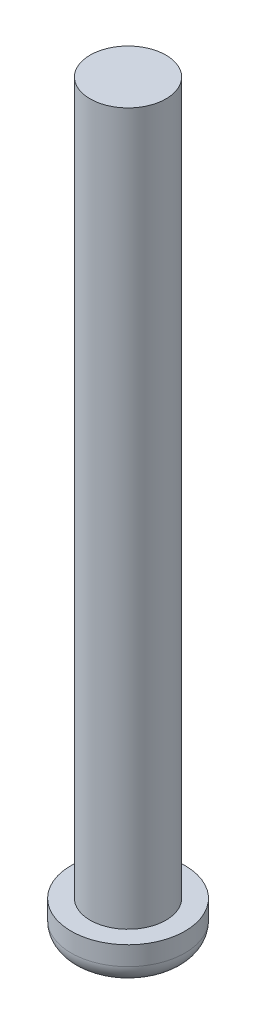
ISO-10303-21;
HEADER;
FILE_DESCRIPTION(('STEP AP214'),'2;1');
FILE_NAME('part.step','',(''),(''),'','','');
FILE_SCHEMA(('AUTOMOTIVE_DESIGN { 1 0 10303 214 1 1 1 1 }'));
ENDSEC;
DATA;
#1=APPLICATION_CONTEXT('core data for automotive mechanical design processes');
#2=APPLICATION_PROTOCOL_DEFINITION('international standard','automotive_design',2000,#1);
#3=PRODUCT_CONTEXT('',#1,'mechanical');
#4=PRODUCT('Part','Part','',(#3));
#5=PRODUCT_RELATED_PRODUCT_CATEGORY('part','',(#4));
#6=PRODUCT_DEFINITION_FORMATION('','',#4);
#7=PRODUCT_DEFINITION_CONTEXT('part definition',#1,'design');
#8=PRODUCT_DEFINITION('design','',#6,#7);
#9=PRODUCT_DEFINITION_SHAPE('','',#8);
#10=(LENGTH_UNIT() NAMED_UNIT(*) SI_UNIT(.MILLI.,.METRE.));
#11=(NAMED_UNIT(*) PLANE_ANGLE_UNIT() SI_UNIT($,.RADIAN.));
#12=(NAMED_UNIT(*) SI_UNIT($,.STERADIAN.) SOLID_ANGLE_UNIT());
#13=UNCERTAINTY_MEASURE_WITH_UNIT(LENGTH_MEASURE(1.E-05),#10,'distance_accuracy_value','');
#14=(GEOMETRIC_REPRESENTATION_CONTEXT(3) GLOBAL_UNCERTAINTY_ASSIGNED_CONTEXT((#13)) GLOBAL_UNIT_ASSIGNED_CONTEXT((#10,
#11,#12)) REPRESENTATION_CONTEXT('',''));
#15=CARTESIAN_POINT('',(0.,0.,0.));
#16=DIRECTION('',(0.,0.,1.));
#17=DIRECTION('',(1.,0.,0.));
#18=AXIS2_PLACEMENT_3D('',#15,#16,#17);
#19=CARTESIAN_POINT('',(0.,75.,0.));
#20=DIRECTION('',(0.,-1.,0.));
#21=DIRECTION('',(0.,0.,-1.));
#22=AXIS2_PLACEMENT_3D('',#19,#20,#21);
#23=CYLINDRICAL_SURFACE('',#22,4.);
#24=CARTESIAN_POINT('',(0.,75.,0.));
#25=DIRECTION('',(0.,1.,0.));
#26=DIRECTION('',(0.,0.,1.));
#27=AXIS2_PLACEMENT_3D('',#24,#25,#26);
#28=CIRCLE('',#27,4.);
#29=CARTESIAN_POINT('',(0.,75.,4.));
#30=VERTEX_POINT('',#29);
#31=EDGE_CURVE('E46',#30,#30,#28,.T.);
#32=ORIENTED_EDGE('',*,*,#31,.F.);
#33=EDGE_LOOP('',(#32));
#34=FACE_BOUND('',#33,.T.);
#35=CARTESIAN_POINT('',(0.,0.,0.));
#36=DIRECTION('',(0.,1.,0.));
#37=DIRECTION('',(0.,0.,1.));
#38=AXIS2_PLACEMENT_3D('',#35,#36,#37);
#39=CIRCLE('',#38,4.);
#40=CARTESIAN_POINT('',(0.,0.,4.));
#41=VERTEX_POINT('',#40);
#42=EDGE_CURVE('E50',#41,#41,#39,.T.);
#43=ORIENTED_EDGE('',*,*,#42,.T.);
#44=EDGE_LOOP('',(#43));
#45=FACE_BOUND('',#44,.T.);
#46=ADVANCED_FACE('F35',(#34,#45),#23,.T.);
#47=CARTESIAN_POINT('',(0.,75.,0.));
#48=DIRECTION('',(0.,1.,0.));
#49=DIRECTION('',(0.,0.,1.));
#50=AXIS2_PLACEMENT_3D('',#47,#48,#49);
#51=PLANE('',#50);
#52=ORIENTED_EDGE('',*,*,#31,.T.);
#53=EDGE_LOOP('',(#52));
#54=FACE_BOUND('',#53,.T.);
#55=ADVANCED_FACE('F75',(#54),#51,.T.);
#56=CARTESIAN_POINT('',(0.,-4.,0.));
#57=DIRECTION('',(0.,1.,0.));
#58=DIRECTION('',(0.,0.,1.));
#59=AXIS2_PLACEMENT_3D('',#56,#57,#58);
#60=CYLINDRICAL_SURFACE('',#59,6.);
#61=CARTESIAN_POINT('',(0.,-2.,0.));
#62=DIRECTION('',(0.,-1.,0.));
#63=DIRECTION('',(0.,0.,-1.));
#64=AXIS2_PLACEMENT_3D('',#61,#62,#63);
#65=CIRCLE('',#64,6.);
#66=CARTESIAN_POINT('',(0.,-2.,-6.));
#67=VERTEX_POINT('',#66);
#68=EDGE_CURVE('E10',#67,#67,#65,.F.);
#69=ORIENTED_EDGE('',*,*,#68,.T.);
#70=EDGE_LOOP('',(#69));
#71=FACE_BOUND('',#70,.T.);
#72=CARTESIAN_POINT('',(0.,0.,0.));
#73=DIRECTION('',(0.,-1.,0.));
#74=DIRECTION('',(0.,0.,-1.));
#75=AXIS2_PLACEMENT_3D('',#72,#73,#74);
#76=CIRCLE('',#75,6.);
#77=CARTESIAN_POINT('',(0.,0.,-6.));
#78=VERTEX_POINT('',#77);
#79=EDGE_CURVE('E54',#78,#78,#76,.T.);
#80=ORIENTED_EDGE('',*,*,#79,.T.);
#81=EDGE_LOOP('',(#80));
#82=FACE_BOUND('',#81,.T.);
#83=ADVANCED_FACE('F59',(#71,#82),#60,.T.);
#84=CARTESIAN_POINT('',(0.,-4.,0.));
#85=DIRECTION('',(0.,-1.,0.));
#86=DIRECTION('',(0.,0.,-1.));
#87=AXIS2_PLACEMENT_3D('',#84,#85,#86);
#88=PLANE('',#87);
#89=CARTESIAN_POINT('',(0.,-4.,0.));
#90=DIRECTION('',(0.,-1.,0.));
#91=DIRECTION('',(0.,0.,-1.));
#92=AXIS2_PLACEMENT_3D('',#89,#90,#91);
#93=CIRCLE('',#92,4.);
#94=CARTESIAN_POINT('',(0.,-4.,-4.));
#95=VERTEX_POINT('',#94);
#96=EDGE_CURVE('E42',#95,#95,#93,.T.);
#97=ORIENTED_EDGE('',*,*,#96,.T.);
#98=EDGE_LOOP('',(#97));
#99=FACE_BOUND('',#98,.T.);
#100=ADVANCED_FACE('F63',(#99),#88,.T.);
#101=CARTESIAN_POINT('',(0.,0.,0.));
#102=DIRECTION('',(0.,-1.,0.));
#103=DIRECTION('',(0.,0.,-1.));
#104=AXIS2_PLACEMENT_3D('',#101,#102,#103);
#105=PLANE('',#104);
#106=ORIENTED_EDGE('',*,*,#42,.F.);
#107=EDGE_LOOP('',(#106));
#108=FACE_BOUND('',#107,.T.);
#109=ORIENTED_EDGE('',*,*,#79,.F.);
#110=EDGE_LOOP('',(#109));
#111=FACE_BOUND('',#110,.T.);
#112=ADVANCED_FACE('F61',(#108,#111),#105,.F.);
#113=CARTESIAN_POINT('',(0.,-2.,0.));
#114=DIRECTION('',(0.,-1.,0.));
#115=DIRECTION('',(0.,0.,-1.));
#116=AXIS2_PLACEMENT_3D('',#113,#114,#115);
#117=TOROIDAL_SURFACE('',#116,4.,2.);
#118=ORIENTED_EDGE('',*,*,#68,.F.);
#119=EDGE_LOOP('',(#118));
#120=FACE_BOUND('',#119,.T.);
#121=ORIENTED_EDGE('',*,*,#96,.F.);
#122=EDGE_LOOP('',(#121));
#123=FACE_BOUND('',#122,.T.);
#124=ADVANCED_FACE('F37',(#120,#123),#117,.T.);
#125=CLOSED_SHELL('',(#46,#55,#83,#100,#112,#124));
#126=MANIFOLD_SOLID_BREP('B2',#125);
#127=ADVANCED_BREP_SHAPE_REPRESENTATION('',(#18,#126),#14);
#128=SHAPE_DEFINITION_REPRESENTATION(#9,#127);
ENDSEC;
END-ISO-10303-21;
